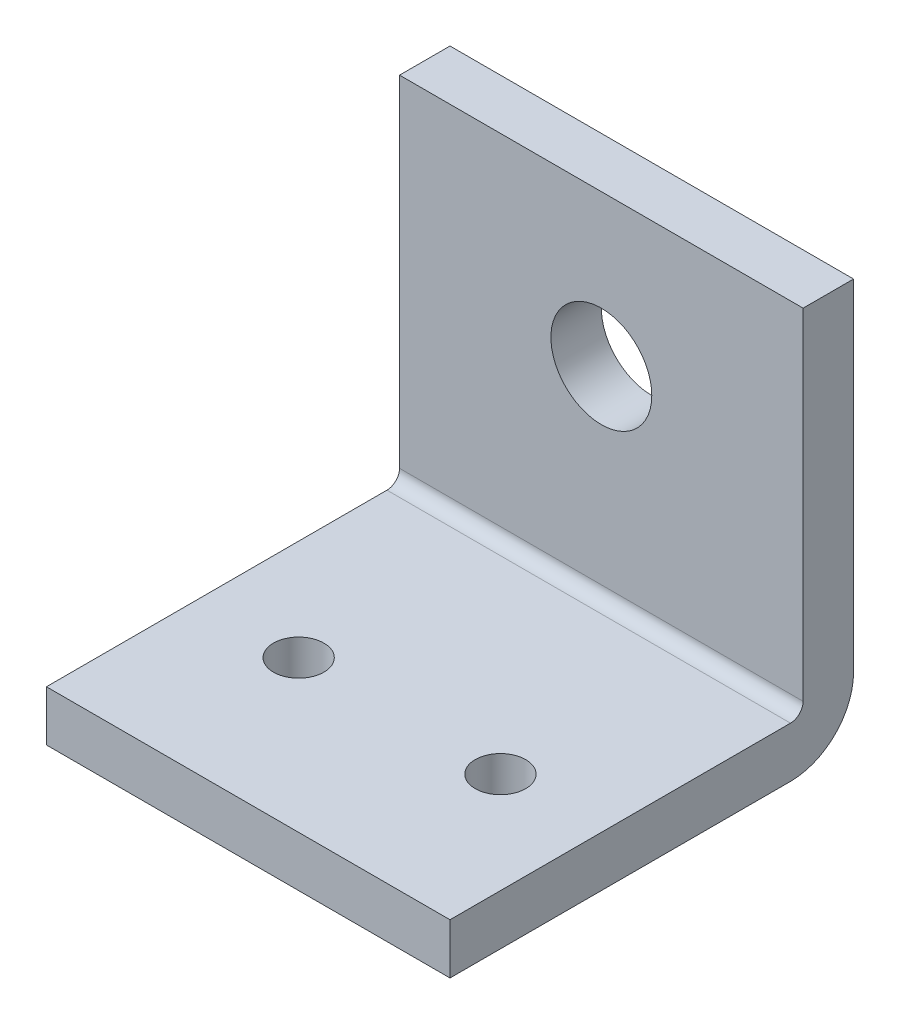
ISO-10303-21;
HEADER;
FILE_DESCRIPTION(('STEP AP214'),'2;1');
FILE_NAME('part.step','',(''),(''),'','','');
FILE_SCHEMA(('AUTOMOTIVE_DESIGN { 1 0 10303 214 1 1 1 1 }'));
ENDSEC;
DATA;
#1=APPLICATION_CONTEXT('core data for automotive mechanical design processes');
#2=APPLICATION_PROTOCOL_DEFINITION('international standard','automotive_design',2000,#1);
#3=PRODUCT_CONTEXT('',#1,'mechanical');
#4=PRODUCT('Part','Part','',(#3));
#5=PRODUCT_RELATED_PRODUCT_CATEGORY('part','',(#4));
#6=PRODUCT_DEFINITION_FORMATION('','',#4);
#7=PRODUCT_DEFINITION_CONTEXT('part definition',#1,'design');
#8=PRODUCT_DEFINITION('design','',#6,#7);
#9=PRODUCT_DEFINITION_SHAPE('','',#8);
#10=(LENGTH_UNIT() NAMED_UNIT(*) SI_UNIT(.MILLI.,.METRE.));
#11=(NAMED_UNIT(*) PLANE_ANGLE_UNIT() SI_UNIT($,.RADIAN.));
#12=(NAMED_UNIT(*) SI_UNIT($,.STERADIAN.) SOLID_ANGLE_UNIT());
#13=UNCERTAINTY_MEASURE_WITH_UNIT(LENGTH_MEASURE(1.E-05),#10,'distance_accuracy_value','');
#14=(GEOMETRIC_REPRESENTATION_CONTEXT(3) GLOBAL_UNCERTAINTY_ASSIGNED_CONTEXT((#13)) GLOBAL_UNIT_ASSIGNED_CONTEXT((#10,
#11,#12)) REPRESENTATION_CONTEXT('',''));
#15=CARTESIAN_POINT('',(0.,0.,0.));
#16=DIRECTION('',(0.,0.,1.));
#17=DIRECTION('',(1.,0.,0.));
#18=AXIS2_PLACEMENT_3D('',#15,#16,#17);
#19=CARTESIAN_POINT('',(0.,5.,0.));
#20=DIRECTION('',(0.,1.,0.));
#21=DIRECTION('',(0.,0.,1.));
#22=AXIS2_PLACEMENT_3D('',#19,#20,#21);
#23=PLANE('',#22);
#24=DIRECTION('',(0.,0.,-1.));
#25=VECTOR('',#24,1.);
#26=CARTESIAN_POINT('',(40.,5.,0.));
#27=LINE('',#26,#25);
#28=CARTESIAN_POINT('',(40.,5.,0.));
#29=VERTEX_POINT('',#28);
#30=CARTESIAN_POINT('',(40.,5.,-33.75));
#31=VERTEX_POINT('',#30);
#32=EDGE_CURVE('E152',#29,#31,#27,.T.);
#33=ORIENTED_EDGE('',*,*,#32,.T.);
#34=DIRECTION('',(1.,0.,0.));
#35=VECTOR('',#34,1.);
#36=CARTESIAN_POINT('',(0.,5.,-33.75));
#37=LINE('',#36,#35);
#38=CARTESIAN_POINT('',(0.,5.,-33.75));
#39=VERTEX_POINT('',#38);
#40=EDGE_CURVE('E62',#31,#39,#37,.F.);
#41=ORIENTED_EDGE('',*,*,#40,.T.);
#42=DIRECTION('',(0.,0.,1.));
#43=VECTOR('',#42,1.);
#44=CARTESIAN_POINT('',(0.,5.,-40.));
#45=LINE('',#44,#43);
#46=CARTESIAN_POINT('',(0.,5.,0.));
#47=VERTEX_POINT('',#46);
#48=EDGE_CURVE('E147',#39,#47,#45,.T.);
#49=ORIENTED_EDGE('',*,*,#48,.T.);
#50=DIRECTION('',(1.,0.,0.));
#51=VECTOR('',#50,1.);
#52=CARTESIAN_POINT('',(0.,5.,0.));
#53=LINE('',#52,#51);
#54=EDGE_CURVE('E149',#47,#29,#53,.T.);
#55=ORIENTED_EDGE('',*,*,#54,.T.);
#56=EDGE_LOOP('',(#33,#41,#49,#55));
#57=FACE_BOUND('',#56,.T.);
#58=CARTESIAN_POINT('',(10.,5.,-15.));
#59=DIRECTION('',(0.,1.,0.));
#60=DIRECTION('',(0.,0.,1.));
#61=AXIS2_PLACEMENT_3D('',#58,#59,#60);
#62=CIRCLE('',#61,2.5);
#63=CARTESIAN_POINT('',(10.,5.,-12.5));
#64=VERTEX_POINT('',#63);
#65=EDGE_CURVE('E141',#64,#64,#62,.T.);
#66=ORIENTED_EDGE('',*,*,#65,.F.);
#67=EDGE_LOOP('',(#66));
#68=FACE_BOUND('',#67,.T.);
#69=CARTESIAN_POINT('',(30.,5.,-15.));
#70=DIRECTION('',(0.,1.,0.));
#71=DIRECTION('',(0.,0.,1.));
#72=AXIS2_PLACEMENT_3D('',#69,#70,#71);
#73=CIRCLE('',#72,2.50000000000001);
#74=CARTESIAN_POINT('',(30.,5.,-12.5));
#75=VERTEX_POINT('',#74);
#76=EDGE_CURVE('E133',#75,#75,#73,.T.);
#77=ORIENTED_EDGE('',*,*,#76,.F.);
#78=EDGE_LOOP('',(#77));
#79=FACE_BOUND('',#78,.T.);
#80=ADVANCED_FACE('F41',(#57,#68,#79),#23,.T.);
#81=CARTESIAN_POINT('',(0.,0.,0.));
#82=DIRECTION('',(0.,1.,0.));
#83=DIRECTION('',(0.,0.,1.));
#84=AXIS2_PLACEMENT_3D('',#81,#82,#83);
#85=PLANE('',#84);
#86=DIRECTION('',(0.,0.,1.));
#87=VECTOR('',#86,1.);
#88=CARTESIAN_POINT('',(0.,0.,-40.));
#89=LINE('',#88,#87);
#90=CARTESIAN_POINT('',(0.,0.,-33.75));
#91=VERTEX_POINT('',#90);
#92=CARTESIAN_POINT('',(0.,0.,0.));
#93=VERTEX_POINT('',#92);
#94=EDGE_CURVE('E144',#91,#93,#89,.T.);
#95=ORIENTED_EDGE('',*,*,#94,.F.);
#96=DIRECTION('',(-1.,0.,0.));
#97=VECTOR('',#96,1.);
#98=CARTESIAN_POINT('',(0.,0.,-33.75));
#99=LINE('',#98,#97);
#100=CARTESIAN_POINT('',(40.,0.,-33.75));
#101=VERTEX_POINT('',#100);
#102=EDGE_CURVE('E175',#91,#101,#99,.F.);
#103=ORIENTED_EDGE('',*,*,#102,.T.);
#104=DIRECTION('',(0.,0.,-1.));
#105=VECTOR('',#104,1.);
#106=CARTESIAN_POINT('',(40.,0.,0.));
#107=LINE('',#106,#105);
#108=CARTESIAN_POINT('',(40.,0.,0.));
#109=VERTEX_POINT('',#108);
#110=EDGE_CURVE('E150',#109,#101,#107,.T.);
#111=ORIENTED_EDGE('',*,*,#110,.F.);
#112=DIRECTION('',(1.,0.,0.));
#113=VECTOR('',#112,1.);
#114=CARTESIAN_POINT('',(0.,0.,0.));
#115=LINE('',#114,#113);
#116=EDGE_CURVE('E156',#93,#109,#115,.T.);
#117=ORIENTED_EDGE('',*,*,#116,.F.);
#118=EDGE_LOOP('',(#95,#103,#111,#117));
#119=FACE_BOUND('',#118,.T.);
#120=CARTESIAN_POINT('',(10.,0.,-15.));
#121=DIRECTION('',(0.,1.,0.));
#122=DIRECTION('',(0.,0.,1.));
#123=AXIS2_PLACEMENT_3D('',#120,#121,#122);
#124=CIRCLE('',#123,2.5);
#125=CARTESIAN_POINT('',(10.,0.,-12.5));
#126=VERTEX_POINT('',#125);
#127=EDGE_CURVE('E139',#126,#126,#124,.T.);
#128=ORIENTED_EDGE('',*,*,#127,.T.);
#129=EDGE_LOOP('',(#128));
#130=FACE_BOUND('',#129,.T.);
#131=CARTESIAN_POINT('',(30.,0.,-15.));
#132=DIRECTION('',(0.,1.,0.));
#133=DIRECTION('',(0.,0.,1.));
#134=AXIS2_PLACEMENT_3D('',#131,#132,#133);
#135=CIRCLE('',#134,2.50000000000001);
#136=CARTESIAN_POINT('',(30.,0.,-12.5));
#137=VERTEX_POINT('',#136);
#138=EDGE_CURVE('E130',#137,#137,#135,.T.);
#139=ORIENTED_EDGE('',*,*,#138,.T.);
#140=EDGE_LOOP('',(#139));
#141=FACE_BOUND('',#140,.T.);
#142=ADVANCED_FACE('F206',(#119,#130,#141),#85,.F.);
#143=CARTESIAN_POINT('',(0.,5.,-40.));
#144=DIRECTION('',(1.,0.,0.));
#145=DIRECTION('',(0.,0.,-1.));
#146=AXIS2_PLACEMENT_3D('',#143,#144,#145);
#147=PLANE('',#146);
#148=DIRECTION('',(0.,-1.,0.));
#149=VECTOR('',#148,1.);
#150=CARTESIAN_POINT('',(0.,5.,-40.));
#151=LINE('',#150,#149);
#152=CARTESIAN_POINT('',(0.,40.,-40.));
#153=VERTEX_POINT('',#152);
#154=CARTESIAN_POINT('',(0.,6.25,-40.));
#155=VERTEX_POINT('',#154);
#156=EDGE_CURVE('E154',#153,#155,#151,.T.);
#157=ORIENTED_EDGE('',*,*,#156,.T.);
#158=CARTESIAN_POINT('',(0.,6.25,-33.75));
#159=DIRECTION('',(1.,0.,0.));
#160=DIRECTION('',(0.,0.,-1.));
#161=AXIS2_PLACEMENT_3D('',#158,#159,#160);
#162=CIRCLE('',#161,6.25);
#163=EDGE_CURVE('E173',#155,#91,#162,.F.);
#164=ORIENTED_EDGE('',*,*,#163,.T.);
#165=ORIENTED_EDGE('',*,*,#94,.T.);
#166=DIRECTION('',(0.,-1.,0.));
#167=VECTOR('',#166,1.);
#168=CARTESIAN_POINT('',(0.,5.,0.));
#169=LINE('',#168,#167);
#170=EDGE_CURVE('E167',#47,#93,#169,.T.);
#171=ORIENTED_EDGE('',*,*,#170,.F.);
#172=ORIENTED_EDGE('',*,*,#48,.F.);
#173=CARTESIAN_POINT('',(0.,6.25,-33.75));
#174=DIRECTION('',(1.,0.,0.));
#175=DIRECTION('',(0.,0.,-1.));
#176=AXIS2_PLACEMENT_3D('',#173,#174,#175);
#177=CIRCLE('',#176,1.25);
#178=CARTESIAN_POINT('',(0.,6.25,-35.));
#179=VERTEX_POINT('',#178);
#180=EDGE_CURVE('E11',#39,#179,#177,.T.);
#181=ORIENTED_EDGE('',*,*,#180,.T.);
#182=DIRECTION('',(0.,-1.,0.));
#183=VECTOR('',#182,1.);
#184=CARTESIAN_POINT('',(0.,40.,-35.));
#185=LINE('',#184,#183);
#186=CARTESIAN_POINT('',(0.,40.,-35.));
#187=VERTEX_POINT('',#186);
#188=EDGE_CURVE('E110',#187,#179,#185,.T.);
#189=ORIENTED_EDGE('',*,*,#188,.F.);
#190=DIRECTION('',(0.,0.,1.));
#191=VECTOR('',#190,1.);
#192=CARTESIAN_POINT('',(0.,40.,-35.));
#193=LINE('',#192,#191);
#194=EDGE_CURVE('E117',#153,#187,#193,.T.);
#195=ORIENTED_EDGE('',*,*,#194,.F.);
#196=EDGE_LOOP('',(#157,#164,#165,#171,#172,#181,#189,#195));
#197=FACE_BOUND('',#196,.T.);
#198=ADVANCED_FACE('F128',(#197),#147,.F.);
#199=CARTESIAN_POINT('',(0.,5.,0.));
#200=DIRECTION('',(0.,0.,-1.));
#201=DIRECTION('',(-1.,0.,0.));
#202=AXIS2_PLACEMENT_3D('',#199,#200,#201);
#203=PLANE('',#202);
#204=ORIENTED_EDGE('',*,*,#116,.T.);
#205=DIRECTION('',(0.,-1.,0.));
#206=VECTOR('',#205,1.);
#207=CARTESIAN_POINT('',(40.,5.,0.));
#208=LINE('',#207,#206);
#209=EDGE_CURVE('E164',#29,#109,#208,.T.);
#210=ORIENTED_EDGE('',*,*,#209,.F.);
#211=ORIENTED_EDGE('',*,*,#54,.F.);
#212=ORIENTED_EDGE('',*,*,#170,.T.);
#213=EDGE_LOOP('',(#204,#210,#211,#212));
#214=FACE_BOUND('',#213,.T.);
#215=ADVANCED_FACE('F222',(#214),#203,.F.);
#216=CARTESIAN_POINT('',(40.,5.,0.));
#217=DIRECTION('',(-1.,0.,0.));
#218=DIRECTION('',(0.,0.,1.));
#219=AXIS2_PLACEMENT_3D('',#216,#217,#218);
#220=PLANE('',#219);
#221=ORIENTED_EDGE('',*,*,#110,.T.);
#222=CARTESIAN_POINT('',(40.,6.25,-33.75));
#223=DIRECTION('',(-1.,0.,0.));
#224=DIRECTION('',(0.,0.,1.));
#225=AXIS2_PLACEMENT_3D('',#222,#223,#224);
#226=CIRCLE('',#225,6.25);
#227=CARTESIAN_POINT('',(40.,6.25,-40.));
#228=VERTEX_POINT('',#227);
#229=EDGE_CURVE('E177',#101,#228,#226,.F.);
#230=ORIENTED_EDGE('',*,*,#229,.T.);
#231=DIRECTION('',(0.,-1.,0.));
#232=VECTOR('',#231,1.);
#233=CARTESIAN_POINT('',(40.,5.,-40.));
#234=LINE('',#233,#232);
#235=CARTESIAN_POINT('',(40.,40.,-40.));
#236=VERTEX_POINT('',#235);
#237=EDGE_CURVE('E161',#236,#228,#234,.T.);
#238=ORIENTED_EDGE('',*,*,#237,.F.);
#239=DIRECTION('',(0.,0.,-1.));
#240=VECTOR('',#239,1.);
#241=CARTESIAN_POINT('',(40.,40.,-40.));
#242=LINE('',#241,#240);
#243=CARTESIAN_POINT('',(40.,40.,-35.));
#244=VERTEX_POINT('',#243);
#245=EDGE_CURVE('E116',#244,#236,#242,.T.);
#246=ORIENTED_EDGE('',*,*,#245,.F.);
#247=DIRECTION('',(0.,-1.,0.));
#248=VECTOR('',#247,1.);
#249=CARTESIAN_POINT('',(40.,40.,-35.));
#250=LINE('',#249,#248);
#251=CARTESIAN_POINT('',(40.,6.25,-35.));
#252=VERTEX_POINT('',#251);
#253=EDGE_CURVE('E112',#244,#252,#250,.T.);
#254=ORIENTED_EDGE('',*,*,#253,.T.);
#255=CARTESIAN_POINT('',(40.,6.25,-33.75));
#256=DIRECTION('',(-1.,0.,0.));
#257=DIRECTION('',(0.,0.,1.));
#258=AXIS2_PLACEMENT_3D('',#255,#256,#257);
#259=CIRCLE('',#258,1.25);
#260=EDGE_CURVE('E49',#252,#31,#259,.T.);
#261=ORIENTED_EDGE('',*,*,#260,.T.);
#262=ORIENTED_EDGE('',*,*,#32,.F.);
#263=ORIENTED_EDGE('',*,*,#209,.T.);
#264=EDGE_LOOP('',(#221,#230,#238,#246,#254,#261,#262,#263));
#265=FACE_BOUND('',#264,.T.);
#266=ADVANCED_FACE('F182',(#265),#220,.F.);
#267=CARTESIAN_POINT('',(40.,5.,-40.));
#268=DIRECTION('',(0.,0.,1.));
#269=DIRECTION('',(1.,0.,0.));
#270=AXIS2_PLACEMENT_3D('',#267,#268,#269);
#271=PLANE('',#270);
#272=CARTESIAN_POINT('',(20.,25.,-40.));
#273=DIRECTION('',(0.,0.,1.));
#274=DIRECTION('',(1.,0.,0.));
#275=AXIS2_PLACEMENT_3D('',#272,#273,#274);
#276=CIRCLE('',#275,5.);
#277=CARTESIAN_POINT('',(25.,25.,-40.));
#278=VERTEX_POINT('',#277);
#279=EDGE_CURVE('E126',#278,#278,#276,.T.);
#280=ORIENTED_EDGE('',*,*,#279,.T.);
#281=EDGE_LOOP('',(#280));
#282=FACE_BOUND('',#281,.T.);
#283=ORIENTED_EDGE('',*,*,#237,.T.);
#284=DIRECTION('',(-1.,0.,0.));
#285=VECTOR('',#284,1.);
#286=CARTESIAN_POINT('',(40.,6.25,-40.));
#287=LINE('',#286,#285);
#288=EDGE_CURVE('E170',#228,#155,#287,.T.);
#289=ORIENTED_EDGE('',*,*,#288,.T.);
#290=ORIENTED_EDGE('',*,*,#156,.F.);
#291=DIRECTION('',(-1.,0.,0.));
#292=VECTOR('',#291,1.);
#293=CARTESIAN_POINT('',(0.,40.,-40.));
#294=LINE('',#293,#292);
#295=EDGE_CURVE('E123',#236,#153,#294,.T.);
#296=ORIENTED_EDGE('',*,*,#295,.F.);
#297=EDGE_LOOP('',(#283,#289,#290,#296));
#298=FACE_BOUND('',#297,.T.);
#299=ADVANCED_FACE('F216',(#282,#298),#271,.F.);
#300=CARTESIAN_POINT('',(10.,5.,-15.));
#301=DIRECTION('',(0.,-1.,0.));
#302=DIRECTION('',(0.,0.,-1.));
#303=AXIS2_PLACEMENT_3D('',#300,#301,#302);
#304=CYLINDRICAL_SURFACE('',#303,2.5);
#305=ORIENTED_EDGE('',*,*,#65,.T.);
#306=EDGE_LOOP('',(#305));
#307=FACE_BOUND('',#306,.T.);
#308=ORIENTED_EDGE('',*,*,#127,.F.);
#309=EDGE_LOOP('',(#308));
#310=FACE_BOUND('',#309,.T.);
#311=ADVANCED_FACE('F202',(#307,#310),#304,.F.);
#312=CARTESIAN_POINT('',(30.,5.,-15.));
#313=DIRECTION('',(0.,-1.,0.));
#314=DIRECTION('',(0.,0.,-1.));
#315=AXIS2_PLACEMENT_3D('',#312,#313,#314);
#316=CYLINDRICAL_SURFACE('',#315,2.50000000000001);
#317=ORIENTED_EDGE('',*,*,#76,.T.);
#318=EDGE_LOOP('',(#317));
#319=FACE_BOUND('',#318,.T.);
#320=ORIENTED_EDGE('',*,*,#138,.F.);
#321=EDGE_LOOP('',(#320));
#322=FACE_BOUND('',#321,.T.);
#323=ADVANCED_FACE('F195',(#319,#322),#316,.F.);
#324=CARTESIAN_POINT('',(40.,40.,-35.));
#325=DIRECTION('',(0.,0.,-1.));
#326=DIRECTION('',(-1.,0.,0.));
#327=AXIS2_PLACEMENT_3D('',#324,#325,#326);
#328=PLANE('',#327);
#329=CARTESIAN_POINT('',(20.,25.,-35.));
#330=DIRECTION('',(0.,0.,1.));
#331=DIRECTION('',(1.,0.,0.));
#332=AXIS2_PLACEMENT_3D('',#329,#330,#331);
#333=CIRCLE('',#332,5.);
#334=CARTESIAN_POINT('',(25.,25.,-35.));
#335=VERTEX_POINT('',#334);
#336=EDGE_CURVE('E187',#335,#335,#333,.T.);
#337=ORIENTED_EDGE('',*,*,#336,.F.);
#338=EDGE_LOOP('',(#337));
#339=FACE_BOUND('',#338,.T.);
#340=ORIENTED_EDGE('',*,*,#188,.T.);
#341=DIRECTION('',(1.,0.,0.));
#342=VECTOR('',#341,1.);
#343=CARTESIAN_POINT('',(40.,6.25,-35.));
#344=LINE('',#343,#342);
#345=EDGE_CURVE('E179',#179,#252,#344,.T.);
#346=ORIENTED_EDGE('',*,*,#345,.T.);
#347=ORIENTED_EDGE('',*,*,#253,.F.);
#348=DIRECTION('',(1.,0.,0.));
#349=VECTOR('',#348,1.);
#350=CARTESIAN_POINT('',(40.,40.,-35.));
#351=LINE('',#350,#349);
#352=EDGE_CURVE('E105',#187,#244,#351,.T.);
#353=ORIENTED_EDGE('',*,*,#352,.F.);
#354=EDGE_LOOP('',(#340,#346,#347,#353));
#355=FACE_BOUND('',#354,.T.);
#356=ADVANCED_FACE('F107',(#339,#355),#328,.F.);
#357=CARTESIAN_POINT('',(0.,40.,0.));
#358=DIRECTION('',(0.,-1.,0.));
#359=DIRECTION('',(0.,0.,-1.));
#360=AXIS2_PLACEMENT_3D('',#357,#358,#359);
#361=PLANE('',#360);
#362=ORIENTED_EDGE('',*,*,#194,.T.);
#363=ORIENTED_EDGE('',*,*,#352,.T.);
#364=ORIENTED_EDGE('',*,*,#245,.T.);
#365=ORIENTED_EDGE('',*,*,#295,.T.);
#366=EDGE_LOOP('',(#362,#363,#364,#365));
#367=FACE_BOUND('',#366,.T.);
#368=ADVANCED_FACE('F121',(#367),#361,.F.);
#369=CARTESIAN_POINT('',(20.,25.,-70.));
#370=DIRECTION('',(0.,0.,1.));
#371=DIRECTION('',(1.,0.,0.));
#372=AXIS2_PLACEMENT_3D('',#369,#370,#371);
#373=CYLINDRICAL_SURFACE('',#372,5.);
#374=ORIENTED_EDGE('',*,*,#336,.T.);
#375=EDGE_LOOP('',(#374));
#376=FACE_BOUND('',#375,.T.);
#377=ORIENTED_EDGE('',*,*,#279,.F.);
#378=EDGE_LOOP('',(#377));
#379=FACE_BOUND('',#378,.T.);
#380=ADVANCED_FACE('F191',(#376,#379),#373,.F.);
#381=CARTESIAN_POINT('',(40.,6.25,-33.75));
#382=DIRECTION('',(-1.,0.,0.));
#383=DIRECTION('',(0.,0.,1.));
#384=AXIS2_PLACEMENT_3D('',#381,#382,#383);
#385=CYLINDRICAL_SURFACE('',#384,6.25);
#386=ORIENTED_EDGE('',*,*,#229,.F.);
#387=ORIENTED_EDGE('',*,*,#102,.F.);
#388=ORIENTED_EDGE('',*,*,#163,.F.);
#389=ORIENTED_EDGE('',*,*,#288,.F.);
#390=EDGE_LOOP('',(#386,#387,#388,#389));
#391=FACE_BOUND('',#390,.T.);
#392=ADVANCED_FACE('F227',(#391),#385,.T.);
#393=CARTESIAN_POINT('',(40.,6.25,-33.75));
#394=DIRECTION('',(1.,0.,0.));
#395=DIRECTION('',(0.,0.,-1.));
#396=AXIS2_PLACEMENT_3D('',#393,#394,#395);
#397=CYLINDRICAL_SURFACE('',#396,1.25);
#398=ORIENTED_EDGE('',*,*,#180,.F.);
#399=ORIENTED_EDGE('',*,*,#40,.F.);
#400=ORIENTED_EDGE('',*,*,#260,.F.);
#401=ORIENTED_EDGE('',*,*,#345,.F.);
#402=EDGE_LOOP('',(#398,#399,#400,#401));
#403=FACE_BOUND('',#402,.T.);
#404=ADVANCED_FACE('F43',(#403),#397,.F.);
#405=CLOSED_SHELL('',(#80,#142,#198,#215,#266,#299,#311,#323,#356,#368,#380,#392,#404));
#406=MANIFOLD_SOLID_BREP('B2',#405);
#407=ADVANCED_BREP_SHAPE_REPRESENTATION('',(#18,#406),#14);
#408=SHAPE_DEFINITION_REPRESENTATION(#9,#407);
ENDSEC;
END-ISO-10303-21;
